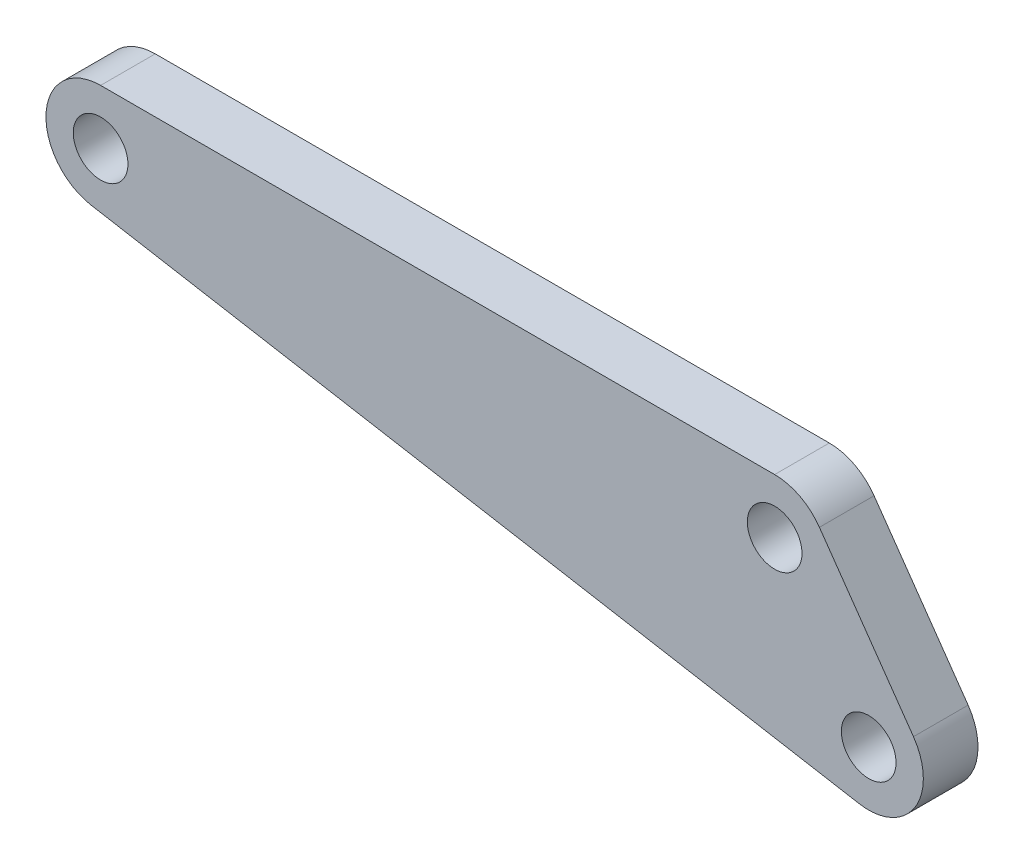
ISO-10303-21;
HEADER;
FILE_DESCRIPTION(('STEP AP214'),'2;1');
FILE_NAME('part.step','',(''),(''),'','','');
FILE_SCHEMA(('AUTOMOTIVE_DESIGN { 1 0 10303 214 1 1 1 1 }'));
ENDSEC;
DATA;
#1=APPLICATION_CONTEXT('core data for automotive mechanical design processes');
#2=APPLICATION_PROTOCOL_DEFINITION('international standard','automotive_design',2000,#1);
#3=PRODUCT_CONTEXT('',#1,'mechanical');
#4=PRODUCT('Part','Part','',(#3));
#5=PRODUCT_RELATED_PRODUCT_CATEGORY('part','',(#4));
#6=PRODUCT_DEFINITION_FORMATION('','',#4);
#7=PRODUCT_DEFINITION_CONTEXT('part definition',#1,'design');
#8=PRODUCT_DEFINITION('design','',#6,#7);
#9=PRODUCT_DEFINITION_SHAPE('','',#8);
#10=(LENGTH_UNIT() NAMED_UNIT(*) SI_UNIT(.MILLI.,.METRE.));
#11=(NAMED_UNIT(*) PLANE_ANGLE_UNIT() SI_UNIT($,.RADIAN.));
#12=(NAMED_UNIT(*) SI_UNIT($,.STERADIAN.) SOLID_ANGLE_UNIT());
#13=UNCERTAINTY_MEASURE_WITH_UNIT(LENGTH_MEASURE(1.E-05),#10,'distance_accuracy_value','');
#14=(GEOMETRIC_REPRESENTATION_CONTEXT(3) GLOBAL_UNCERTAINTY_ASSIGNED_CONTEXT((#13)) GLOBAL_UNIT_ASSIGNED_CONTEXT((#10,
#11,#12)) REPRESENTATION_CONTEXT('',''));
#15=CARTESIAN_POINT('',(0.,0.,0.));
#16=DIRECTION('',(0.,0.,1.));
#17=DIRECTION('',(1.,0.,0.));
#18=AXIS2_PLACEMENT_3D('',#15,#16,#17);
#19=CARTESIAN_POINT('',(0.,0.,3.));
#20=DIRECTION('',(0.,0.,1.));
#21=DIRECTION('',(1.,0.,0.));
#22=AXIS2_PLACEMENT_3D('',#19,#20,#21);
#23=PLANE('',#22);
#24=CARTESIAN_POINT('',(0.,0.,3.));
#25=DIRECTION('',(0.,0.,1.));
#26=DIRECTION('',(1.,0.,0.));
#27=AXIS2_PLACEMENT_3D('',#24,#25,#26);
#28=CIRCLE('',#27,1.5);
#29=CARTESIAN_POINT('',(1.5,0.,3.));
#30=VERTEX_POINT('',#29);
#31=EDGE_CURVE('E207',#30,#30,#28,.T.);
#32=ORIENTED_EDGE('',*,*,#31,.F.);
#33=EDGE_LOOP('',(#32));
#34=FACE_BOUND('',#33,.T.);
#35=CARTESIAN_POINT('',(0.,0.,3.));
#36=DIRECTION('',(0.,0.,1.));
#37=DIRECTION('',(1.,0.,0.));
#38=AXIS2_PLACEMENT_3D('',#35,#36,#37);
#39=CIRCLE('',#38,3.);
#40=CARTESIAN_POINT('',(2.45745613286697,1.72072930905315,3.));
#41=VERTEX_POINT('',#40);
#42=CARTESIAN_POINT('',(0.,3.,3.));
#43=VERTEX_POINT('',#42);
#44=EDGE_CURVE('E146',#41,#43,#39,.T.);
#45=ORIENTED_EDGE('',*,*,#44,.T.);
#46=DIRECTION('',(-1.,0.,0.));
#47=VECTOR('',#46,1.);
#48=CARTESIAN_POINT('',(-37.,2.99999999999999,3.));
#49=LINE('',#48,#47);
#50=CARTESIAN_POINT('',(-37.,2.99999999999999,3.));
#51=VERTEX_POINT('',#50);
#52=EDGE_CURVE('E94',#43,#51,#49,.T.);
#53=ORIENTED_EDGE('',*,*,#52,.T.);
#54=CARTESIAN_POINT('',(-37.,0.,3.));
#55=DIRECTION('',(0.,0.,1.));
#56=DIRECTION('',(1.,0.,0.));
#57=AXIS2_PLACEMENT_3D('',#54,#55,#56);
#58=CIRCLE('',#57,3.);
#59=CARTESIAN_POINT('',(-37.5167319592021,-2.95516295360158,3.));
#60=VERTEX_POINT('',#59);
#61=EDGE_CURVE('E107',#51,#60,#58,.T.);
#62=ORIENTED_EDGE('',*,*,#61,.T.);
#63=DIRECTION('',(0.98505431786719,-0.172243986400701,0.));
#64=VECTOR('',#63,1.);
#65=CARTESIAN_POINT('',(4.64545596795735,-10.3275313522025,3.));
#66=LINE('',#65,#64);
#67=CARTESIAN_POINT('',(4.64545596795735,-10.3275313522025,3.));
#68=VERTEX_POINT('',#67);
#69=EDGE_CURVE('E101',#60,#68,#66,.T.);
#70=ORIENTED_EDGE('',*,*,#69,.T.);
#71=CARTESIAN_POINT('',(5.16218792715945,-7.3723683986009,3.));
#72=DIRECTION('',(0.,0.,1.));
#73=DIRECTION('',(1.,0.,0.));
#74=AXIS2_PLACEMENT_3D('',#71,#72,#73);
#75=CIRCLE('',#74,3.);
#76=CARTESIAN_POINT('',(7.61964406002642,-5.65163908954775,3.));
#77=VERTEX_POINT('',#76);
#78=EDGE_CURVE('E105',#68,#77,#75,.T.);
#79=ORIENTED_EDGE('',*,*,#78,.T.);
#80=DIRECTION('',(-0.57357643635105,0.819152044288989,0.));
#81=VECTOR('',#80,1.);
#82=CARTESIAN_POINT('',(2.45745613286697,1.72072930905315,3.));
#83=LINE('',#82,#81);
#84=EDGE_CURVE('E57',#77,#41,#83,.T.);
#85=ORIENTED_EDGE('',*,*,#84,.T.);
#86=EDGE_LOOP('',(#45,#53,#62,#70,#79,#85));
#87=FACE_BOUND('',#86,.T.);
#88=CARTESIAN_POINT('',(-37.,0.,3.));
#89=DIRECTION('',(0.,0.,1.));
#90=DIRECTION('',(1.,0.,0.));
#91=AXIS2_PLACEMENT_3D('',#88,#89,#90);
#92=CIRCLE('',#91,1.5);
#93=CARTESIAN_POINT('',(-35.5,0.,3.));
#94=VERTEX_POINT('',#93);
#95=EDGE_CURVE('E134',#94,#94,#92,.T.);
#96=ORIENTED_EDGE('',*,*,#95,.F.);
#97=EDGE_LOOP('',(#96));
#98=FACE_BOUND('',#97,.T.);
#99=CARTESIAN_POINT('',(5.16218792715945,-7.3723683986009,3.));
#100=DIRECTION('',(0.,0.,1.));
#101=DIRECTION('',(1.,0.,0.));
#102=AXIS2_PLACEMENT_3D('',#99,#100,#101);
#103=CIRCLE('',#102,1.5);
#104=CARTESIAN_POINT('',(6.66218792715945,-7.3723683986009,3.));
#105=VERTEX_POINT('',#104);
#106=EDGE_CURVE('E196',#105,#105,#103,.T.);
#107=ORIENTED_EDGE('',*,*,#106,.F.);
#108=EDGE_LOOP('',(#107));
#109=FACE_BOUND('',#108,.T.);
#110=ADVANCED_FACE('F39',(#34,#87,#98,#109),#23,.T.);
#111=CARTESIAN_POINT('',(0.,0.,0.));
#112=DIRECTION('',(0.,0.,1.));
#113=DIRECTION('',(1.,0.,0.));
#114=AXIS2_PLACEMENT_3D('',#111,#112,#113);
#115=PLANE('',#114);
#116=CARTESIAN_POINT('',(0.,0.,0.));
#117=DIRECTION('',(0.,0.,1.));
#118=DIRECTION('',(1.,0.,0.));
#119=AXIS2_PLACEMENT_3D('',#116,#117,#118);
#120=CIRCLE('',#119,3.);
#121=CARTESIAN_POINT('',(2.45745613286697,1.72072930905315,0.));
#122=VERTEX_POINT('',#121);
#123=CARTESIAN_POINT('',(0.,3.,0.));
#124=VERTEX_POINT('',#123);
#125=EDGE_CURVE('E129',#122,#124,#120,.T.);
#126=ORIENTED_EDGE('',*,*,#125,.F.);
#127=DIRECTION('',(-0.57357643635105,0.819152044288989,0.));
#128=VECTOR('',#127,1.);
#129=CARTESIAN_POINT('',(2.45745613286697,1.72072930905315,0.));
#130=LINE('',#129,#128);
#131=CARTESIAN_POINT('',(7.61964406002642,-5.65163908954775,0.));
#132=VERTEX_POINT('',#131);
#133=EDGE_CURVE('E86',#132,#122,#130,.T.);
#134=ORIENTED_EDGE('',*,*,#133,.F.);
#135=CARTESIAN_POINT('',(5.16218792715945,-7.3723683986009,0.));
#136=DIRECTION('',(0.,0.,1.));
#137=DIRECTION('',(1.,0.,0.));
#138=AXIS2_PLACEMENT_3D('',#135,#136,#137);
#139=CIRCLE('',#138,3.);
#140=CARTESIAN_POINT('',(4.64545596795735,-10.3275313522025,0.));
#141=VERTEX_POINT('',#140);
#142=EDGE_CURVE('E80',#141,#132,#139,.T.);
#143=ORIENTED_EDGE('',*,*,#142,.F.);
#144=DIRECTION('',(0.98505431786719,-0.172243986400701,0.));
#145=VECTOR('',#144,1.);
#146=CARTESIAN_POINT('',(4.64545596795735,-10.3275313522025,0.));
#147=LINE('',#146,#145);
#148=CARTESIAN_POINT('',(-37.5167319592021,-2.95516295360158,0.));
#149=VERTEX_POINT('',#148);
#150=EDGE_CURVE('E116',#149,#141,#147,.T.);
#151=ORIENTED_EDGE('',*,*,#150,.F.);
#152=CARTESIAN_POINT('',(-37.,0.,0.));
#153=DIRECTION('',(0.,0.,1.));
#154=DIRECTION('',(1.,0.,0.));
#155=AXIS2_PLACEMENT_3D('',#152,#153,#154);
#156=CIRCLE('',#155,3.);
#157=CARTESIAN_POINT('',(-37.,2.99999999999999,0.));
#158=VERTEX_POINT('',#157);
#159=EDGE_CURVE('E137',#158,#149,#156,.T.);
#160=ORIENTED_EDGE('',*,*,#159,.F.);
#161=DIRECTION('',(-1.,0.,0.));
#162=VECTOR('',#161,1.);
#163=CARTESIAN_POINT('',(-37.,2.99999999999999,0.));
#164=LINE('',#163,#162);
#165=EDGE_CURVE('E133',#124,#158,#164,.T.);
#166=ORIENTED_EDGE('',*,*,#165,.F.);
#167=EDGE_LOOP('',(#126,#134,#143,#151,#160,#166));
#168=FACE_BOUND('',#167,.T.);
#169=CARTESIAN_POINT('',(-37.,0.,0.));
#170=DIRECTION('',(0.,0.,1.));
#171=DIRECTION('',(1.,0.,0.));
#172=AXIS2_PLACEMENT_3D('',#169,#170,#171);
#173=CIRCLE('',#172,1.5);
#174=CARTESIAN_POINT('',(-35.5,0.,0.));
#175=VERTEX_POINT('',#174);
#176=EDGE_CURVE('E211',#175,#175,#173,.T.);
#177=ORIENTED_EDGE('',*,*,#176,.T.);
#178=EDGE_LOOP('',(#177));
#179=FACE_BOUND('',#178,.T.);
#180=CARTESIAN_POINT('',(0.,0.,0.));
#181=DIRECTION('',(0.,0.,1.));
#182=DIRECTION('',(1.,0.,0.));
#183=AXIS2_PLACEMENT_3D('',#180,#181,#182);
#184=CIRCLE('',#183,1.5);
#185=CARTESIAN_POINT('',(1.5,0.,0.));
#186=VERTEX_POINT('',#185);
#187=EDGE_CURVE('E204',#186,#186,#184,.T.);
#188=ORIENTED_EDGE('',*,*,#187,.T.);
#189=EDGE_LOOP('',(#188));
#190=FACE_BOUND('',#189,.T.);
#191=CARTESIAN_POINT('',(5.16218792715945,-7.3723683986009,0.));
#192=DIRECTION('',(0.,0.,1.));
#193=DIRECTION('',(1.,0.,0.));
#194=AXIS2_PLACEMENT_3D('',#191,#192,#193);
#195=CIRCLE('',#194,1.5);
#196=CARTESIAN_POINT('',(6.66218792715945,-7.3723683986009,0.));
#197=VERTEX_POINT('',#196);
#198=EDGE_CURVE('E199',#197,#197,#195,.T.);
#199=ORIENTED_EDGE('',*,*,#198,.T.);
#200=EDGE_LOOP('',(#199));
#201=FACE_BOUND('',#200,.T.);
#202=ADVANCED_FACE('F159',(#168,#179,#190,#201),#115,.F.);
#203=CARTESIAN_POINT('',(0.,0.,3.));
#204=DIRECTION('',(0.,0.,-1.));
#205=DIRECTION('',(-1.,0.,0.));
#206=AXIS2_PLACEMENT_3D('',#203,#204,#205);
#207=CYLINDRICAL_SURFACE('',#206,3.);
#208=ORIENTED_EDGE('',*,*,#125,.T.);
#209=DIRECTION('',(0.,0.,-1.));
#210=VECTOR('',#209,1.);
#211=CARTESIAN_POINT('',(0.,3.,3.));
#212=LINE('',#211,#210);
#213=EDGE_CURVE('E11',#43,#124,#212,.T.);
#214=ORIENTED_EDGE('',*,*,#213,.F.);
#215=ORIENTED_EDGE('',*,*,#44,.F.);
#216=DIRECTION('',(0.,0.,-1.));
#217=VECTOR('',#216,1.);
#218=CARTESIAN_POINT('',(2.45745613286697,1.72072930905315,3.));
#219=LINE('',#218,#217);
#220=EDGE_CURVE('E125',#41,#122,#219,.T.);
#221=ORIENTED_EDGE('',*,*,#220,.T.);
#222=EDGE_LOOP('',(#208,#214,#215,#221));
#223=FACE_BOUND('',#222,.T.);
#224=ADVANCED_FACE('F41',(#223),#207,.T.);
#225=CARTESIAN_POINT('',(-37.,2.99999999999999,3.));
#226=DIRECTION('',(0.,-1.,0.));
#227=DIRECTION('',(1.,0.,0.));
#228=AXIS2_PLACEMENT_3D('',#225,#226,#227);
#229=PLANE('',#228);
#230=ORIENTED_EDGE('',*,*,#165,.T.);
#231=DIRECTION('',(0.,0.,-1.));
#232=VECTOR('',#231,1.);
#233=CARTESIAN_POINT('',(-37.,2.99999999999999,3.));
#234=LINE('',#233,#232);
#235=EDGE_CURVE('E49',#51,#158,#234,.T.);
#236=ORIENTED_EDGE('',*,*,#235,.F.);
#237=ORIENTED_EDGE('',*,*,#52,.F.);
#238=ORIENTED_EDGE('',*,*,#213,.T.);
#239=EDGE_LOOP('',(#230,#236,#237,#238));
#240=FACE_BOUND('',#239,.T.);
#241=ADVANCED_FACE('F267',(#240),#229,.F.);
#242=CARTESIAN_POINT('',(-37.,0.,3.));
#243=DIRECTION('',(0.,0.,-1.));
#244=DIRECTION('',(-1.,0.,0.));
#245=AXIS2_PLACEMENT_3D('',#242,#243,#244);
#246=CYLINDRICAL_SURFACE('',#245,3.);
#247=ORIENTED_EDGE('',*,*,#159,.T.);
#248=DIRECTION('',(0.,0.,-1.));
#249=VECTOR('',#248,1.);
#250=CARTESIAN_POINT('',(-37.5167319592021,-2.95516295360158,3.));
#251=LINE('',#250,#249);
#252=EDGE_CURVE('E118',#60,#149,#251,.T.);
#253=ORIENTED_EDGE('',*,*,#252,.F.);
#254=ORIENTED_EDGE('',*,*,#61,.F.);
#255=ORIENTED_EDGE('',*,*,#235,.T.);
#256=EDGE_LOOP('',(#247,#253,#254,#255));
#257=FACE_BOUND('',#256,.T.);
#258=ADVANCED_FACE('F156',(#257),#246,.T.);
#259=CARTESIAN_POINT('',(4.64545596795735,-10.3275313522025,3.));
#260=DIRECTION('',(0.172243986400701,0.98505431786719,0.));
#261=DIRECTION('',(-0.98505431786719,0.172243986400701,0.));
#262=AXIS2_PLACEMENT_3D('',#259,#260,#261);
#263=PLANE('',#262);
#264=ORIENTED_EDGE('',*,*,#150,.T.);
#265=DIRECTION('',(0.,0.,-1.));
#266=VECTOR('',#265,1.);
#267=CARTESIAN_POINT('',(4.64545596795735,-10.3275313522025,3.));
#268=LINE('',#267,#266);
#269=EDGE_CURVE('E113',#68,#141,#268,.T.);
#270=ORIENTED_EDGE('',*,*,#269,.F.);
#271=ORIENTED_EDGE('',*,*,#69,.F.);
#272=ORIENTED_EDGE('',*,*,#252,.T.);
#273=EDGE_LOOP('',(#264,#270,#271,#272));
#274=FACE_BOUND('',#273,.T.);
#275=ADVANCED_FACE('F114',(#274),#263,.F.);
#276=CARTESIAN_POINT('',(5.16218792715945,-7.3723683986009,3.));
#277=DIRECTION('',(0.,0.,-1.));
#278=DIRECTION('',(-1.,0.,0.));
#279=AXIS2_PLACEMENT_3D('',#276,#277,#278);
#280=CYLINDRICAL_SURFACE('',#279,3.);
#281=ORIENTED_EDGE('',*,*,#142,.T.);
#282=DIRECTION('',(0.,0.,-1.));
#283=VECTOR('',#282,1.);
#284=CARTESIAN_POINT('',(7.61964406002642,-5.65163908954775,3.));
#285=LINE('',#284,#283);
#286=EDGE_CURVE('E119',#77,#132,#285,.T.);
#287=ORIENTED_EDGE('',*,*,#286,.F.);
#288=ORIENTED_EDGE('',*,*,#78,.F.);
#289=ORIENTED_EDGE('',*,*,#269,.T.);
#290=EDGE_LOOP('',(#281,#287,#288,#289));
#291=FACE_BOUND('',#290,.T.);
#292=ADVANCED_FACE('F121',(#291),#280,.T.);
#293=CARTESIAN_POINT('',(2.45745613286697,1.72072930905315,3.));
#294=DIRECTION('',(-0.819152044288989,-0.57357643635105,0.));
#295=DIRECTION('',(0.57357643635105,-0.819152044288989,0.));
#296=AXIS2_PLACEMENT_3D('',#293,#294,#295);
#297=PLANE('',#296);
#298=ORIENTED_EDGE('',*,*,#133,.T.);
#299=ORIENTED_EDGE('',*,*,#220,.F.);
#300=ORIENTED_EDGE('',*,*,#84,.F.);
#301=ORIENTED_EDGE('',*,*,#286,.T.);
#302=EDGE_LOOP('',(#298,#299,#300,#301));
#303=FACE_BOUND('',#302,.T.);
#304=ADVANCED_FACE('F164',(#303),#297,.F.);
#305=CARTESIAN_POINT('',(-37.,0.,3.));
#306=DIRECTION('',(0.,0.,-1.));
#307=DIRECTION('',(-1.,0.,0.));
#308=AXIS2_PLACEMENT_3D('',#305,#306,#307);
#309=CYLINDRICAL_SURFACE('',#308,1.5);
#310=ORIENTED_EDGE('',*,*,#95,.T.);
#311=EDGE_LOOP('',(#310));
#312=FACE_BOUND('',#311,.T.);
#313=ORIENTED_EDGE('',*,*,#176,.F.);
#314=EDGE_LOOP('',(#313));
#315=FACE_BOUND('',#314,.T.);
#316=ADVANCED_FACE('F166',(#312,#315),#309,.F.);
#317=CARTESIAN_POINT('',(0.,0.,3.));
#318=DIRECTION('',(0.,0.,-1.));
#319=DIRECTION('',(-1.,0.,0.));
#320=AXIS2_PLACEMENT_3D('',#317,#318,#319);
#321=CYLINDRICAL_SURFACE('',#320,1.5);
#322=ORIENTED_EDGE('',*,*,#31,.T.);
#323=EDGE_LOOP('',(#322));
#324=FACE_BOUND('',#323,.T.);
#325=ORIENTED_EDGE('',*,*,#187,.F.);
#326=EDGE_LOOP('',(#325));
#327=FACE_BOUND('',#326,.T.);
#328=ADVANCED_FACE('F172',(#324,#327),#321,.F.);
#329=CARTESIAN_POINT('',(5.16218792715945,-7.3723683986009,3.));
#330=DIRECTION('',(0.,0.,-1.));
#331=DIRECTION('',(-1.,0.,0.));
#332=AXIS2_PLACEMENT_3D('',#329,#330,#331);
#333=CYLINDRICAL_SURFACE('',#332,1.5);
#334=ORIENTED_EDGE('',*,*,#106,.T.);
#335=EDGE_LOOP('',(#334));
#336=FACE_BOUND('',#335,.T.);
#337=ORIENTED_EDGE('',*,*,#198,.F.);
#338=EDGE_LOOP('',(#337));
#339=FACE_BOUND('',#338,.T.);
#340=ADVANCED_FACE('F187',(#336,#339),#333,.F.);
#341=CLOSED_SHELL('',(#110,#202,#224,#241,#258,#275,#292,#304,#316,#328,#340));
#342=MANIFOLD_SOLID_BREP('B2',#341);
#343=ADVANCED_BREP_SHAPE_REPRESENTATION('',(#18,#342),#14);
#344=SHAPE_DEFINITION_REPRESENTATION(#9,#343);
ENDSEC;
END-ISO-10303-21;
